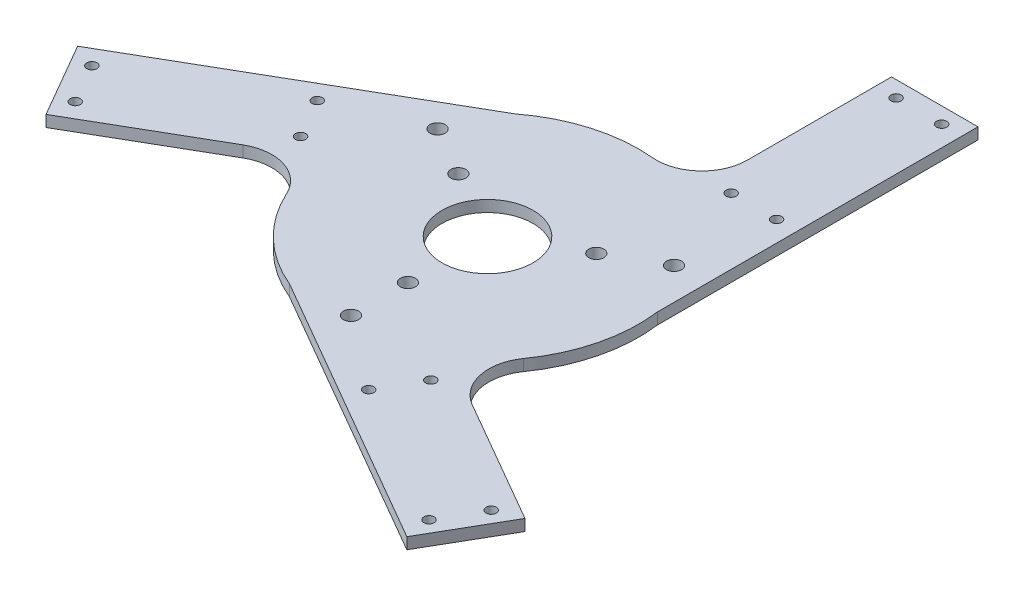
ISO-10303-21;
HEADER;
FILE_DESCRIPTION(('STEP AP214'),'2;1');
FILE_NAME('part.step','',(''),(''),'','','');
FILE_SCHEMA(('AUTOMOTIVE_DESIGN { 1 0 10303 214 1 1 1 1 }'));
ENDSEC;
DATA;
#1=APPLICATION_CONTEXT('core data for automotive mechanical design processes');
#2=APPLICATION_PROTOCOL_DEFINITION('international standard','automotive_design',2000,#1);
#3=PRODUCT_CONTEXT('',#1,'mechanical');
#4=PRODUCT('Part','Part','',(#3));
#5=PRODUCT_RELATED_PRODUCT_CATEGORY('part','',(#4));
#6=PRODUCT_DEFINITION_FORMATION('','',#4);
#7=PRODUCT_DEFINITION_CONTEXT('part definition',#1,'design');
#8=PRODUCT_DEFINITION('design','',#6,#7);
#9=PRODUCT_DEFINITION_SHAPE('','',#8);
#10=(LENGTH_UNIT() NAMED_UNIT(*) SI_UNIT(.MILLI.,.METRE.));
#11=(NAMED_UNIT(*) PLANE_ANGLE_UNIT() SI_UNIT($,.RADIAN.));
#12=(NAMED_UNIT(*) SI_UNIT($,.STERADIAN.) SOLID_ANGLE_UNIT());
#13=UNCERTAINTY_MEASURE_WITH_UNIT(LENGTH_MEASURE(1.E-05),#10,'distance_accuracy_value','');
#14=(GEOMETRIC_REPRESENTATION_CONTEXT(3) GLOBAL_UNCERTAINTY_ASSIGNED_CONTEXT((#13)) GLOBAL_UNIT_ASSIGNED_CONTEXT((#10,
#11,#12)) REPRESENTATION_CONTEXT('',''));
#15=CARTESIAN_POINT('',(0.,0.,0.));
#16=DIRECTION('',(0.,0.,1.));
#17=DIRECTION('',(1.,0.,0.));
#18=AXIS2_PLACEMENT_3D('',#15,#16,#17);
#19=CARTESIAN_POINT('',(28.01,-5.,0.));
#20=DIRECTION('',(1.,0.,0.));
#21=DIRECTION('',(0.,0.,-1.));
#22=AXIS2_PLACEMENT_3D('',#19,#20,#21);
#23=PLANE('',#22);
#24=DIRECTION('',(0.,0.,-1.));
#25=VECTOR('',#24,1.);
#26=CARTESIAN_POINT('',(28.01,0.,0.));
#27=LINE('',#26,#25);
#28=CARTESIAN_POINT('',(28.01,0.,-86.2045653840739));
#29=VERTEX_POINT('',#28);
#30=CARTESIAN_POINT('',(28.01,0.,-149.538220784093));
#31=VERTEX_POINT('',#30);
#32=EDGE_CURVE('E195',#29,#31,#27,.T.);
#33=ORIENTED_EDGE('',*,*,#32,.T.);
#34=DIRECTION('',(0.,1.,0.));
#35=VECTOR('',#34,1.);
#36=CARTESIAN_POINT('',(28.01,-5.,-149.538220784093));
#37=LINE('',#36,#35);
#38=CARTESIAN_POINT('',(28.01,-5.,-149.538220784093));
#39=VERTEX_POINT('',#38);
#40=EDGE_CURVE('E11',#39,#31,#37,.T.);
#41=ORIENTED_EDGE('',*,*,#40,.F.);
#42=DIRECTION('',(0.,0.,-1.));
#43=VECTOR('',#42,1.);
#44=CARTESIAN_POINT('',(28.01,-5.,0.));
#45=LINE('',#44,#43);
#46=CARTESIAN_POINT('',(28.01,-5.,-86.2045653840739));
#47=VERTEX_POINT('',#46);
#48=EDGE_CURVE('E185',#47,#39,#45,.T.);
#49=ORIENTED_EDGE('',*,*,#48,.F.);
#50=DIRECTION('',(0.,1.,0.));
#51=VECTOR('',#50,1.);
#52=CARTESIAN_POINT('',(28.01,-5.,-86.2045653840739));
#53=LINE('',#52,#51);
#54=EDGE_CURVE('E42',#47,#29,#53,.T.);
#55=ORIENTED_EDGE('',*,*,#54,.T.);
#56=EDGE_LOOP('',(#33,#41,#49,#55));
#57=FACE_BOUND('',#56,.T.);
#58=ADVANCED_FACE('F39',(#57),#23,.F.);
#59=CARTESIAN_POINT('',(-1.09224194589461E-13,-5.,-149.538220784093));
#60=DIRECTION('',(0.,0.,1.));
#61=DIRECTION('',(1.,0.,0.));
#62=AXIS2_PLACEMENT_3D('',#59,#60,#61);
#63=PLANE('',#62);
#64=DIRECTION('',(1.,0.,0.));
#65=VECTOR('',#64,1.);
#66=CARTESIAN_POINT('',(-1.09224194589461E-13,0.,-149.538220784093));
#67=LINE('',#66,#65);
#68=CARTESIAN_POINT('',(66.01,0.,-149.538220784093));
#69=VERTEX_POINT('',#68);
#70=EDGE_CURVE('E103',#31,#69,#67,.T.);
#71=ORIENTED_EDGE('',*,*,#70,.T.);
#72=DIRECTION('',(0.,1.,0.));
#73=VECTOR('',#72,1.);
#74=CARTESIAN_POINT('',(66.01,-5.,-149.538220784093));
#75=LINE('',#74,#73);
#76=CARTESIAN_POINT('',(66.01,-5.,-149.538220784093));
#77=VERTEX_POINT('',#76);
#78=EDGE_CURVE('E48',#77,#69,#75,.T.);
#79=ORIENTED_EDGE('',*,*,#78,.F.);
#80=DIRECTION('',(1.,0.,0.));
#81=VECTOR('',#80,1.);
#82=CARTESIAN_POINT('',(-1.09224194589461E-13,-5.,-149.538220784093));
#83=LINE('',#82,#81);
#84=EDGE_CURVE('E56',#39,#77,#83,.T.);
#85=ORIENTED_EDGE('',*,*,#84,.F.);
#86=ORIENTED_EDGE('',*,*,#40,.T.);
#87=EDGE_LOOP('',(#71,#79,#85,#86));
#88=FACE_BOUND('',#87,.T.);
#89=ADVANCED_FACE('F474',(#88),#63,.F.);
#90=CARTESIAN_POINT('',(66.01,-5.,0.));
#91=DIRECTION('',(-1.,0.,0.));
#92=DIRECTION('',(0.,0.,1.));
#93=AXIS2_PLACEMENT_3D('',#90,#91,#92);
#94=PLANE('',#93);
#95=DIRECTION('',(0.,0.,1.));
#96=VECTOR('',#95,1.);
#97=CARTESIAN_POINT('',(66.01,0.,0.));
#98=LINE('',#97,#96);
#99=CARTESIAN_POINT('',(66.01,0.,-8.66203924603394));
#100=VERTEX_POINT('',#99);
#101=EDGE_CURVE('E162',#69,#100,#98,.T.);
#102=ORIENTED_EDGE('',*,*,#101,.T.);
#103=DIRECTION('',(0.,1.,0.));
#104=VECTOR('',#103,1.);
#105=CARTESIAN_POINT('',(66.01,-5.,-8.66203924603394));
#106=LINE('',#105,#104);
#107=CARTESIAN_POINT('',(66.01,-5.,-8.66203924603394));
#108=VERTEX_POINT('',#107);
#109=EDGE_CURVE('E160',#108,#100,#106,.T.);
#110=ORIENTED_EDGE('',*,*,#109,.F.);
#111=DIRECTION('',(0.,0.,1.));
#112=VECTOR('',#111,1.);
#113=CARTESIAN_POINT('',(66.01,-5.,0.));
#114=LINE('',#113,#112);
#115=EDGE_CURVE('E152',#77,#108,#114,.T.);
#116=ORIENTED_EDGE('',*,*,#115,.F.);
#117=ORIENTED_EDGE('',*,*,#78,.T.);
#118=EDGE_LOOP('',(#102,#110,#116,#117));
#119=FACE_BOUND('',#118,.T.);
#120=ADVANCED_FACE('F161',(#119),#94,.F.);
#121=CARTESIAN_POINT('',(0.,-5.,0.));
#122=DIRECTION('',(0.,1.,0.));
#123=DIRECTION('',(0.,0.,1.));
#124=AXIS2_PLACEMENT_3D('',#121,#122,#123);
#125=CYLINDRICAL_SURFACE('',#124,66.5759042289313);
#126=CARTESIAN_POINT('',(0.,0.,0.));
#127=DIRECTION('',(0.,1.,0.));
#128=DIRECTION('',(0.,0.,1.));
#129=AXIS2_PLACEMENT_3D('',#126,#127,#128);
#130=CIRCLE('',#129,66.5759042289313);
#131=CARTESIAN_POINT('',(54.329325780327,0.,38.4795450097182));
#132=VERTEX_POINT('',#131);
#133=EDGE_CURVE('E362',#132,#100,#130,.T.);
#134=ORIENTED_EDGE('',*,*,#133,.F.);
#135=DIRECTION('',(0.,1.,0.));
#136=VECTOR('',#135,1.);
#137=CARTESIAN_POINT('',(54.329325780327,-5.,38.4795450097182));
#138=LINE('',#137,#136);
#139=CARTESIAN_POINT('',(54.329325780327,-5.,38.4795450097182));
#140=VERTEX_POINT('',#139);
#141=EDGE_CURVE('E166',#140,#132,#138,.T.);
#142=ORIENTED_EDGE('',*,*,#141,.F.);
#143=CARTESIAN_POINT('',(0.,-5.,0.));
#144=DIRECTION('',(0.,1.,0.));
#145=DIRECTION('',(0.,0.,1.));
#146=AXIS2_PLACEMENT_3D('',#143,#144,#145);
#147=CIRCLE('',#146,66.5759042289313);
#148=EDGE_CURVE('E156',#140,#108,#147,.T.);
#149=ORIENTED_EDGE('',*,*,#148,.T.);
#150=ORIENTED_EDGE('',*,*,#109,.T.);
#151=EDGE_LOOP('',(#134,#142,#149,#150));
#152=FACE_BOUND('',#151,.T.);
#153=ADVANCED_FACE('F168',(#152),#125,.T.);
#154=CARTESIAN_POINT('',(70.6503435448045,-5.,50.0391461763507));
#155=DIRECTION('',(0.,1.,0.));
#156=DIRECTION('',(0.,0.,1.));
#157=AXIS2_PLACEMENT_3D('',#154,#155,#156);
#158=CYLINDRICAL_SURFACE('',#157,20.);
#159=CARTESIAN_POINT('',(70.6503435448045,0.,50.0391461763507));
#160=DIRECTION('',(0.,1.,0.));
#161=DIRECTION('',(0.,0.,1.));
#162=AXIS2_PLACEMENT_3D('',#159,#160,#161);
#163=CIRCLE('',#162,20.);
#164=CARTESIAN_POINT('',(60.6503435448044,0.,67.3596542520394));
#165=VERTEX_POINT('',#164);
#166=EDGE_CURVE('E379',#132,#165,#163,.T.);
#167=ORIENTED_EDGE('',*,*,#166,.T.);
#168=DIRECTION('',(0.,1.,0.));
#169=VECTOR('',#168,1.);
#170=CARTESIAN_POINT('',(60.6503435448044,-5.,67.3596542520394));
#171=LINE('',#170,#169);
#172=CARTESIAN_POINT('',(60.6503435448044,-5.,67.3596542520394));
#173=VERTEX_POINT('',#172);
#174=EDGE_CURVE('E385',#173,#165,#171,.T.);
#175=ORIENTED_EDGE('',*,*,#174,.F.);
#176=CARTESIAN_POINT('',(70.6503435448045,-5.,50.0391461763507));
#177=DIRECTION('',(0.,1.,0.));
#178=DIRECTION('',(0.,0.,1.));
#179=AXIS2_PLACEMENT_3D('',#176,#177,#178);
#180=CIRCLE('',#179,20.);
#181=EDGE_CURVE('E170',#140,#173,#180,.T.);
#182=ORIENTED_EDGE('',*,*,#181,.F.);
#183=ORIENTED_EDGE('',*,*,#141,.T.);
#184=EDGE_LOOP('',(#167,#175,#182,#183));
#185=FACE_BOUND('',#184,.T.);
#186=ADVANCED_FACE('F446',(#185),#158,.F.);
#187=CARTESIAN_POINT('',(-14.0050000000001,-5.,24.2573715600021));
#188=DIRECTION('',(-0.500000000000004,0.,0.866025403784436));
#189=DIRECTION('',(0.866025403784436,0.,0.500000000000004));
#190=AXIS2_PLACEMENT_3D('',#187,#188,#189);
#191=PLANE('',#190);
#192=DIRECTION('',(0.866025403784436,0.,0.500000000000004));
#193=VECTOR('',#192,1.);
#194=CARTESIAN_POINT('',(-14.0050000000001,0.,24.2573715600021));
#195=LINE('',#194,#193);
#196=CARTESIAN_POINT('',(115.49889803575,0.,99.0264819520493));
#197=VERTEX_POINT('',#196);
#198=EDGE_CURVE('E377',#165,#197,#195,.T.);
#199=ORIENTED_EDGE('',*,*,#198,.T.);
#200=DIRECTION('',(0.,1.,0.));
#201=VECTOR('',#200,1.);
#202=CARTESIAN_POINT('',(115.49889803575,-5.,99.0264819520493));
#203=LINE('',#202,#201);
#204=CARTESIAN_POINT('',(115.49889803575,-5.,99.0264819520493));
#205=VERTEX_POINT('',#204);
#206=EDGE_CURVE('E388',#205,#197,#203,.T.);
#207=ORIENTED_EDGE('',*,*,#206,.F.);
#208=DIRECTION('',(0.866025403784436,0.,0.500000000000004));
#209=VECTOR('',#208,1.);
#210=CARTESIAN_POINT('',(-14.0050000000001,-5.,24.2573715600021));
#211=LINE('',#210,#209);
#212=EDGE_CURVE('E174',#173,#205,#211,.T.);
#213=ORIENTED_EDGE('',*,*,#212,.F.);
#214=ORIENTED_EDGE('',*,*,#174,.T.);
#215=EDGE_LOOP('',(#199,#207,#213,#214));
#216=FACE_BOUND('',#215,.T.);
#217=ADVANCED_FACE('F449',(#216),#191,.F.);
#218=CARTESIAN_POINT('',(129.503898035751,-5.,74.769110392047));
#219=DIRECTION('',(-0.866025403784437,0.,-0.500000000000003));
#220=DIRECTION('',(-0.500000000000003,0.,0.866025403784437));
#221=AXIS2_PLACEMENT_3D('',#218,#219,#220);
#222=PLANE('',#221);
#223=DIRECTION('',(-0.500000000000003,0.,0.866025403784437));
#224=VECTOR('',#223,1.);
#225=CARTESIAN_POINT('',(129.503898035751,0.,74.769110392047));
#226=LINE('',#225,#224);
#227=CARTESIAN_POINT('',(96.4988980357503,0.,131.935447295858));
#228=VERTEX_POINT('',#227);
#229=EDGE_CURVE('E375',#197,#228,#226,.T.);
#230=ORIENTED_EDGE('',*,*,#229,.T.);
#231=DIRECTION('',(0.,1.,0.));
#232=VECTOR('',#231,1.);
#233=CARTESIAN_POINT('',(96.4988980357503,-5.,131.935447295858));
#234=LINE('',#233,#232);
#235=CARTESIAN_POINT('',(96.4988980357503,-5.,131.935447295858));
#236=VERTEX_POINT('',#235);
#237=EDGE_CURVE('E391',#236,#228,#234,.T.);
#238=ORIENTED_EDGE('',*,*,#237,.F.);
#239=DIRECTION('',(-0.500000000000003,0.,0.866025403784437));
#240=VECTOR('',#239,1.);
#241=CARTESIAN_POINT('',(129.503898035751,-5.,74.769110392047));
#242=LINE('',#241,#240);
#243=EDGE_CURVE('E452',#205,#236,#242,.T.);
#244=ORIENTED_EDGE('',*,*,#243,.F.);
#245=ORIENTED_EDGE('',*,*,#206,.T.);
#246=EDGE_LOOP('',(#230,#238,#244,#245));
#247=FACE_BOUND('',#246,.T.);
#248=ADVANCED_FACE('F464',(#247),#222,.F.);
#249=CARTESIAN_POINT('',(-33.0050000000003,-5.,57.1663369038107));
#250=DIRECTION('',(0.500000000000004,0.,-0.866025403784436));
#251=DIRECTION('',(-0.866025403784436,0.,-0.500000000000004));
#252=AXIS2_PLACEMENT_3D('',#249,#250,#251);
#253=PLANE('',#252);
#254=DIRECTION('',(-0.866025403784436,0.,-0.500000000000004));
#255=VECTOR('',#254,1.);
#256=CARTESIAN_POINT('',(-33.0050000000003,0.,57.1663369038107));
#257=LINE('',#256,#255);
#258=CARTESIAN_POINT('',(-25.5034539643571,0.,61.4973565268277));
#259=VERTEX_POINT('',#258);
#260=EDGE_CURVE('E372',#228,#259,#257,.T.);
#261=ORIENTED_EDGE('',*,*,#260,.T.);
#262=DIRECTION('',(0.,1.,0.));
#263=VECTOR('',#262,1.);
#264=CARTESIAN_POINT('',(-25.5034539643571,-5.,61.4973565268277));
#265=LINE('',#264,#263);
#266=CARTESIAN_POINT('',(-25.5034539643571,-5.,61.4973565268277));
#267=VERTEX_POINT('',#266);
#268=EDGE_CURVE('E394',#267,#259,#265,.T.);
#269=ORIENTED_EDGE('',*,*,#268,.F.);
#270=DIRECTION('',(-0.866025403784436,0.,-0.500000000000004));
#271=VECTOR('',#270,1.);
#272=CARTESIAN_POINT('',(-33.0050000000003,-5.,57.1663369038107));
#273=LINE('',#272,#271);
#274=EDGE_CURVE('E179',#236,#267,#273,.T.);
#275=ORIENTED_EDGE('',*,*,#274,.F.);
#276=ORIENTED_EDGE('',*,*,#237,.T.);
#277=EDGE_LOOP('',(#261,#269,#275,#276));
#278=FACE_BOUND('',#277,.T.);
#279=ADVANCED_FACE('F462',(#278),#253,.F.);
#280=CARTESIAN_POINT('',(-60.4889263946463,0.,27.8108037913846));
#281=VERTEX_POINT('',#280);
#282=EDGE_CURVE('E363',#281,#259,#130,.T.);
#283=ORIENTED_EDGE('',*,*,#282,.F.);
#284=DIRECTION('',(0.,1.,0.));
#285=VECTOR('',#284,1.);
#286=CARTESIAN_POINT('',(-60.4889263946463,-5.,27.8108037913846));
#287=LINE('',#286,#285);
#288=CARTESIAN_POINT('',(-60.4889263946463,-5.,27.8108037913846));
#289=VERTEX_POINT('',#288);
#290=EDGE_CURVE('E396',#289,#281,#287,.T.);
#291=ORIENTED_EDGE('',*,*,#290,.F.);
#292=EDGE_CURVE('E172',#289,#267,#147,.T.);
#293=ORIENTED_EDGE('',*,*,#292,.T.);
#294=ORIENTED_EDGE('',*,*,#268,.T.);
#295=EDGE_LOOP('',(#283,#291,#293,#294));
#296=FACE_BOUND('',#295,.T.);
#297=ADVANCED_FACE('F439',(#296),#125,.T.);
#298=CARTESIAN_POINT('',(-78.660343544805,-5.,36.1654192077229));
#299=DIRECTION('',(0.,1.,0.));
#300=DIRECTION('',(0.,0.,1.));
#301=AXIS2_PLACEMENT_3D('',#298,#299,#300);
#302=CYLINDRICAL_SURFACE('',#301,20.);
#303=CARTESIAN_POINT('',(-78.660343544805,0.,36.1654192077229));
#304=DIRECTION('',(0.,1.,0.));
#305=DIRECTION('',(0.,0.,1.));
#306=AXIS2_PLACEMENT_3D('',#303,#304,#305);
#307=CIRCLE('',#306,20.);
#308=CARTESIAN_POINT('',(-88.6603435448049,0.,18.844911132034));
#309=VERTEX_POINT('',#308);
#310=EDGE_CURVE('E370',#281,#309,#307,.T.);
#311=ORIENTED_EDGE('',*,*,#310,.T.);
#312=DIRECTION('',(0.,1.,0.));
#313=VECTOR('',#312,1.);
#314=CARTESIAN_POINT('',(-88.6603435448049,-5.,18.844911132034));
#315=LINE('',#314,#313);
#316=CARTESIAN_POINT('',(-88.6603435448049,-5.,18.844911132034));
#317=VERTEX_POINT('',#316);
#318=EDGE_CURVE('E398',#317,#309,#315,.T.);
#319=ORIENTED_EDGE('',*,*,#318,.F.);
#320=CARTESIAN_POINT('',(-78.660343544805,-5.,36.1654192077229));
#321=DIRECTION('',(0.,1.,0.));
#322=DIRECTION('',(0.,0.,1.));
#323=AXIS2_PLACEMENT_3D('',#320,#321,#322);
#324=CIRCLE('',#323,20.);
#325=EDGE_CURVE('E180',#289,#317,#324,.T.);
#326=ORIENTED_EDGE('',*,*,#325,.F.);
#327=ORIENTED_EDGE('',*,*,#290,.T.);
#328=EDGE_LOOP('',(#311,#319,#326,#327));
#329=FACE_BOUND('',#328,.T.);
#330=ADVANCED_FACE('F433',(#329),#302,.F.);
#331=CARTESIAN_POINT('',(-14.0049999999998,-5.,-24.2573715600022));
#332=DIRECTION('',(-0.499999999999992,0.,-0.866025403784443));
#333=DIRECTION('',(-0.866025403784443,0.,0.499999999999992));
#334=AXIS2_PLACEMENT_3D('',#331,#332,#333);
#335=PLANE('',#334);
#336=DIRECTION('',(-0.866025403784443,0.,0.499999999999992));
#337=VECTOR('',#336,1.);
#338=CARTESIAN_POINT('',(-14.0049999999998,0.,-24.2573715600022));
#339=LINE('',#338,#337);
#340=CARTESIAN_POINT('',(-143.508898035751,0.,50.5117388320431));
#341=VERTEX_POINT('',#340);
#342=EDGE_CURVE('E368',#309,#341,#339,.T.);
#343=ORIENTED_EDGE('',*,*,#342,.T.);
#344=DIRECTION('',(0.,1.,0.));
#345=VECTOR('',#344,1.);
#346=CARTESIAN_POINT('',(-143.508898035751,-5.,50.5117388320431));
#347=LINE('',#346,#345);
#348=CARTESIAN_POINT('',(-143.508898035751,-5.,50.5117388320431));
#349=VERTEX_POINT('',#348);
#350=EDGE_CURVE('E401',#349,#341,#347,.T.);
#351=ORIENTED_EDGE('',*,*,#350,.F.);
#352=DIRECTION('',(-0.866025403784443,0.,0.499999999999992));
#353=VECTOR('',#352,1.);
#354=CARTESIAN_POINT('',(-14.0049999999998,-5.,-24.2573715600022));
#355=LINE('',#354,#353);
#356=EDGE_CURVE('E429',#317,#349,#355,.T.);
#357=ORIENTED_EDGE('',*,*,#356,.F.);
#358=ORIENTED_EDGE('',*,*,#318,.T.);
#359=EDGE_LOOP('',(#343,#351,#357,#358));
#360=FACE_BOUND('',#359,.T.);
#361=ADVANCED_FACE('F428',(#360),#335,.F.);
#362=CARTESIAN_POINT('',(-129.503898035751,-5.,74.7691103920455));
#363=DIRECTION('',(0.866025403784443,0.,-0.499999999999993));
#364=DIRECTION('',(-0.499999999999993,0.,-0.866025403784443));
#365=AXIS2_PLACEMENT_3D('',#362,#363,#364);
#366=PLANE('',#365);
#367=DIRECTION('',(-0.499999999999993,0.,-0.866025403784443));
#368=VECTOR('',#367,1.);
#369=CARTESIAN_POINT('',(-129.503898035751,0.,74.7691103920455));
#370=LINE('',#369,#368);
#371=CARTESIAN_POINT('',(-162.508898035751,0.,17.6027734882343));
#372=VERTEX_POINT('',#371);
#373=EDGE_CURVE('E366',#341,#372,#370,.T.);
#374=ORIENTED_EDGE('',*,*,#373,.T.);
#375=DIRECTION('',(0.,1.,0.));
#376=VECTOR('',#375,1.);
#377=CARTESIAN_POINT('',(-162.508898035751,-5.,17.6027734882343));
#378=LINE('',#377,#376);
#379=CARTESIAN_POINT('',(-162.508898035751,-5.,17.6027734882343));
#380=VERTEX_POINT('',#379);
#381=EDGE_CURVE('E404',#380,#372,#378,.T.);
#382=ORIENTED_EDGE('',*,*,#381,.F.);
#383=DIRECTION('',(-0.499999999999993,0.,-0.866025403784443));
#384=VECTOR('',#383,1.);
#385=CARTESIAN_POINT('',(-129.503898035751,-5.,74.7691103920455));
#386=LINE('',#385,#384);
#387=EDGE_CURVE('E184',#349,#380,#386,.T.);
#388=ORIENTED_EDGE('',*,*,#387,.F.);
#389=ORIENTED_EDGE('',*,*,#350,.T.);
#390=EDGE_LOOP('',(#374,#382,#388,#389));
#391=FACE_BOUND('',#390,.T.);
#392=ADVANCED_FACE('F424',(#391),#366,.F.);
#393=CARTESIAN_POINT('',(-33.0049999999994,-5.,-57.1663369038111));
#394=DIRECTION('',(0.499999999999992,0.,0.866025403784443));
#395=DIRECTION('',(0.866025403784443,0.,-0.499999999999992));
#396=AXIS2_PLACEMENT_3D('',#393,#394,#395);
#397=PLANE('',#396);
#398=DIRECTION('',(0.866025403784443,0.,-0.499999999999992));
#399=VECTOR('',#398,1.);
#400=CARTESIAN_POINT('',(-33.0049999999994,0.,-57.1663369038111));
#401=LINE('',#400,#399);
#402=CARTESIAN_POINT('',(-40.5065460356427,0.,-52.8353172807942));
#403=VERTEX_POINT('',#402);
#404=EDGE_CURVE('E361',#372,#403,#401,.T.);
#405=ORIENTED_EDGE('',*,*,#404,.T.);
#406=DIRECTION('',(0.,1.,0.));
#407=VECTOR('',#406,1.);
#408=CARTESIAN_POINT('',(-40.5065460356427,-5.,-52.8353172807942));
#409=LINE('',#408,#407);
#410=CARTESIAN_POINT('',(-40.5065460356427,-5.,-52.8353172807942));
#411=VERTEX_POINT('',#410);
#412=EDGE_CURVE('E407',#411,#403,#409,.T.);
#413=ORIENTED_EDGE('',*,*,#412,.F.);
#414=DIRECTION('',(0.866025403784443,0.,-0.499999999999992));
#415=VECTOR('',#414,1.);
#416=CARTESIAN_POINT('',(-33.0049999999994,-5.,-57.1663369038111));
#417=LINE('',#416,#415);
#418=EDGE_CURVE('E182',#380,#411,#417,.T.);
#419=ORIENTED_EDGE('',*,*,#418,.F.);
#420=ORIENTED_EDGE('',*,*,#381,.T.);
#421=EDGE_LOOP('',(#405,#413,#419,#420));
#422=FACE_BOUND('',#421,.T.);
#423=ADVANCED_FACE('F417',(#422),#397,.F.);
#424=CARTESIAN_POINT('',(6.1596006143189,0.,-66.2903488011031));
#425=VERTEX_POINT('',#424);
#426=EDGE_CURVE('E356',#425,#403,#130,.T.);
#427=ORIENTED_EDGE('',*,*,#426,.F.);
#428=DIRECTION('',(0.,1.,0.));
#429=VECTOR('',#428,1.);
#430=CARTESIAN_POINT('',(6.1596006143189,-5.,-66.2903488011031));
#431=LINE('',#430,#429);
#432=CARTESIAN_POINT('',(6.1596006143189,-5.,-66.2903488011031));
#433=VERTEX_POINT('',#432);
#434=EDGE_CURVE('E408',#433,#425,#431,.T.);
#435=ORIENTED_EDGE('',*,*,#434,.F.);
#436=EDGE_CURVE('E173',#433,#411,#147,.T.);
#437=ORIENTED_EDGE('',*,*,#436,.T.);
#438=ORIENTED_EDGE('',*,*,#412,.T.);
#439=EDGE_LOOP('',(#427,#435,#437,#438));
#440=FACE_BOUND('',#439,.T.);
#441=ADVANCED_FACE('F419',(#440),#125,.T.);
#442=CARTESIAN_POINT('',(8.01,-5.,-86.2045653840739));
#443=DIRECTION('',(0.,1.,0.));
#444=DIRECTION('',(0.,0.,1.));
#445=AXIS2_PLACEMENT_3D('',#442,#443,#444);
#446=CYLINDRICAL_SURFACE('',#445,20.);
#447=CARTESIAN_POINT('',(8.01,0.,-86.2045653840739));
#448=DIRECTION('',(0.,1.,0.));
#449=DIRECTION('',(0.,0.,1.));
#450=AXIS2_PLACEMENT_3D('',#447,#448,#449);
#451=CIRCLE('',#450,20.);
#452=EDGE_CURVE('E350',#425,#29,#451,.T.);
#453=ORIENTED_EDGE('',*,*,#452,.T.);
#454=ORIENTED_EDGE('',*,*,#54,.F.);
#455=CARTESIAN_POINT('',(8.01,-5.,-86.2045653840739));
#456=DIRECTION('',(0.,1.,0.));
#457=DIRECTION('',(0.,0.,1.));
#458=AXIS2_PLACEMENT_3D('',#455,#456,#457);
#459=CIRCLE('',#458,20.);
#460=EDGE_CURVE('E115',#433,#47,#459,.T.);
#461=ORIENTED_EDGE('',*,*,#460,.F.);
#462=ORIENTED_EDGE('',*,*,#434,.T.);
#463=EDGE_LOOP('',(#453,#454,#461,#462));
#464=FACE_BOUND('',#463,.T.);
#465=ADVANCED_FACE('F411',(#464),#446,.F.);
#466=CARTESIAN_POINT('',(0.,-5.,0.));
#467=DIRECTION('',(0.,1.,0.));
#468=DIRECTION('',(0.,0.,1.));
#469=AXIS2_PLACEMENT_3D('',#466,#467,#468);
#470=PLANE('',#469);
#471=CARTESIAN_POINT('',(57.01,-5.,-142.538220784093));
#472=DIRECTION('',(0.,1.,0.));
#473=DIRECTION('',(0.,0.,1.));
#474=AXIS2_PLACEMENT_3D('',#471,#472,#473);
#475=CIRCLE('',#474,2.24999999999999);
#476=CARTESIAN_POINT('',(57.01,-5.,-140.288220784093));
#477=VERTEX_POINT('',#476);
#478=EDGE_CURVE('E297',#477,#477,#475,.T.);
#479=ORIENTED_EDGE('',*,*,#478,.T.);
#480=EDGE_LOOP('',(#479));
#481=FACE_BOUND('',#480,.T.);
#482=CARTESIAN_POINT('',(37.0100000000001,-5.,-142.538220784093));
#483=DIRECTION('',(0.,1.,0.));
#484=DIRECTION('',(0.,0.,1.));
#485=AXIS2_PLACEMENT_3D('',#482,#483,#484);
#486=CIRCLE('',#485,2.24999999999999);
#487=CARTESIAN_POINT('',(37.0100000000001,-5.,-140.288220784093));
#488=VERTEX_POINT('',#487);
#489=EDGE_CURVE('E291',#488,#488,#486,.T.);
#490=ORIENTED_EDGE('',*,*,#489,.T.);
#491=EDGE_LOOP('',(#490));
#492=FACE_BOUND('',#491,.T.);
#493=CARTESIAN_POINT('',(37.0100000000001,-5.,-70.0382207840932));
#494=DIRECTION('',(0.,1.,0.));
#495=DIRECTION('',(0.,0.,1.));
#496=AXIS2_PLACEMENT_3D('',#493,#494,#495);
#497=CIRCLE('',#496,2.24999999999999);
#498=CARTESIAN_POINT('',(37.0100000000001,-5.,-67.7882207840932));
#499=VERTEX_POINT('',#498);
#500=EDGE_CURVE('E285',#499,#499,#497,.T.);
#501=ORIENTED_EDGE('',*,*,#500,.T.);
#502=EDGE_LOOP('',(#501));
#503=FACE_BOUND('',#502,.T.);
#504=CARTESIAN_POINT('',(57.0100000000001,-5.,-70.0382207840932));
#505=DIRECTION('',(0.,1.,0.));
#506=DIRECTION('',(0.,0.,1.));
#507=AXIS2_PLACEMENT_3D('',#504,#505,#506);
#508=CIRCLE('',#507,2.24999999999999);
#509=CARTESIAN_POINT('',(57.0100000000001,-5.,-67.7882207840932));
#510=VERTEX_POINT('',#509);
#511=EDGE_CURVE('E279',#510,#510,#508,.T.);
#512=ORIENTED_EDGE('',*,*,#511,.T.);
#513=EDGE_LOOP('',(#512));
#514=FACE_BOUND('',#513,.T.);
#515=CARTESIAN_POINT('',(94.9367202092832,-5.,120.641218661793));
#516=DIRECTION('',(0.,1.,0.));
#517=DIRECTION('',(0.,0.,1.));
#518=AXIS2_PLACEMENT_3D('',#515,#516,#517);
#519=CIRCLE('',#518,2.24999999999999);
#520=CARTESIAN_POINT('',(94.9367202092832,-5.,122.891218661793));
#521=VERTEX_POINT('',#520);
#522=EDGE_CURVE('E273',#521,#521,#519,.T.);
#523=ORIENTED_EDGE('',*,*,#522,.T.);
#524=EDGE_LOOP('',(#523));
#525=FACE_BOUND('',#524,.T.);
#526=CARTESIAN_POINT('',(104.936720209283,-5.,103.320710586105));
#527=DIRECTION('',(0.,1.,0.));
#528=DIRECTION('',(0.,0.,1.));
#529=AXIS2_PLACEMENT_3D('',#526,#527,#528);
#530=CIRCLE('',#529,2.24999999999999);
#531=CARTESIAN_POINT('',(104.936720209283,-5.,105.570710586105));
#532=VERTEX_POINT('',#531);
#533=EDGE_CURVE('E267',#532,#532,#530,.T.);
#534=ORIENTED_EDGE('',*,*,#533,.T.);
#535=EDGE_LOOP('',(#534));
#536=FACE_BOUND('',#535,.T.);
#537=CARTESIAN_POINT('',(42.1498784349114,-5.,67.0707105861046));
#538=DIRECTION('',(0.,1.,0.));
#539=DIRECTION('',(0.,0.,1.));
#540=AXIS2_PLACEMENT_3D('',#537,#538,#539);
#541=CIRCLE('',#540,2.24999999999999);
#542=CARTESIAN_POINT('',(42.1498784349114,-5.,69.3207105861046));
#543=VERTEX_POINT('',#542);
#544=EDGE_CURVE('E261',#543,#543,#541,.T.);
#545=ORIENTED_EDGE('',*,*,#544,.T.);
#546=EDGE_LOOP('',(#545));
#547=FACE_BOUND('',#546,.T.);
#548=CARTESIAN_POINT('',(32.1498784349114,-5.,84.3912186617934));
#549=DIRECTION('',(0.,1.,0.));
#550=DIRECTION('',(0.,0.,1.));
#551=AXIS2_PLACEMENT_3D('',#548,#549,#550);
#552=CIRCLE('',#551,2.24999999999999);
#553=CARTESIAN_POINT('',(32.1498784349114,-5.,86.6412186617934));
#554=VERTEX_POINT('',#553);
#555=EDGE_CURVE('E255',#554,#554,#552,.T.);
#556=ORIENTED_EDGE('',*,*,#555,.T.);
#557=EDGE_LOOP('',(#556));
#558=FACE_BOUND('',#557,.T.);
#559=CARTESIAN_POINT('',(-151.946720209245,-5.,21.8970021223139));
#560=DIRECTION('',(0.,1.,0.));
#561=DIRECTION('',(0.,0.,1.));
#562=AXIS2_PLACEMENT_3D('',#559,#560,#561);
#563=CIRCLE('',#562,2.24999999999999);
#564=CARTESIAN_POINT('',(-151.946720209245,-5.,24.1470021223139));
#565=VERTEX_POINT('',#564);
#566=EDGE_CURVE('E249',#565,#565,#563,.T.);
#567=ORIENTED_EDGE('',*,*,#566,.T.);
#568=EDGE_LOOP('',(#567));
#569=FACE_BOUND('',#568,.T.);
#570=CARTESIAN_POINT('',(-141.946720209245,-5.,39.2175101980027));
#571=DIRECTION('',(0.,1.,0.));
#572=DIRECTION('',(0.,0.,1.));
#573=AXIS2_PLACEMENT_3D('',#570,#571,#572);
#574=CIRCLE('',#573,2.25);
#575=CARTESIAN_POINT('',(-141.946720209245,-5.,41.4675101980027));
#576=VERTEX_POINT('',#575);
#577=EDGE_CURVE('E243',#576,#576,#574,.T.);
#578=ORIENTED_EDGE('',*,*,#577,.T.);
#579=EDGE_LOOP('',(#578));
#580=FACE_BOUND('',#579,.T.);
#581=CARTESIAN_POINT('',(-79.1598784348728,-5.,2.9675101980027));
#582=DIRECTION('',(0.,1.,0.));
#583=DIRECTION('',(0.,0.,1.));
#584=AXIS2_PLACEMENT_3D('',#581,#582,#583);
#585=CIRCLE('',#584,2.24999999999999);
#586=CARTESIAN_POINT('',(-79.1598784348728,-5.,5.21751019800269));
#587=VERTEX_POINT('',#586);
#588=EDGE_CURVE('E237',#587,#587,#585,.T.);
#589=ORIENTED_EDGE('',*,*,#588,.T.);
#590=EDGE_LOOP('',(#589));
#591=FACE_BOUND('',#590,.T.);
#592=CARTESIAN_POINT('',(-89.1598784348728,-5.,-14.3529978776861));
#593=DIRECTION('',(0.,1.,0.));
#594=DIRECTION('',(0.,0.,1.));
#595=AXIS2_PLACEMENT_3D('',#592,#593,#594);
#596=CIRCLE('',#595,2.24999999999999);
#597=CARTESIAN_POINT('',(-89.1598784348728,-5.,-12.1029978776861));
#598=VERTEX_POINT('',#597);
#599=EDGE_CURVE('E231',#598,#598,#596,.T.);
#600=ORIENTED_EDGE('',*,*,#599,.T.);
#601=EDGE_LOOP('',(#600));
#602=FACE_BOUND('',#601,.T.);
#603=CARTESIAN_POINT('',(0.,-5.,60.));
#604=DIRECTION('',(0.,-1.,0.));
#605=DIRECTION('',(0.,0.,-1.));
#606=AXIS2_PLACEMENT_3D('',#603,#604,#605);
#607=CIRCLE('',#606,3.29999999999999);
#608=CARTESIAN_POINT('',(0.,-5.,56.7));
#609=VERTEX_POINT('',#608);
#610=EDGE_CURVE('E228',#609,#609,#607,.T.);
#611=ORIENTED_EDGE('',*,*,#610,.F.);
#612=EDGE_LOOP('',(#611));
#613=FACE_BOUND('',#612,.T.);
#614=CARTESIAN_POINT('',(0.,-5.,35.));
#615=DIRECTION('',(0.,-1.,0.));
#616=DIRECTION('',(0.,0.,-1.));
#617=AXIS2_PLACEMENT_3D('',#614,#615,#616);
#618=CIRCLE('',#617,3.29999999999999);
#619=CARTESIAN_POINT('',(0.,-5.,31.7));
#620=VERTEX_POINT('',#619);
#621=EDGE_CURVE('E222',#620,#620,#618,.T.);
#622=ORIENTED_EDGE('',*,*,#621,.F.);
#623=EDGE_LOOP('',(#622));
#624=FACE_BOUND('',#623,.T.);
#625=CARTESIAN_POINT('',(51.9615242270662,-5.,-30.0000000000002));
#626=DIRECTION('',(0.,-1.,0.));
#627=DIRECTION('',(0.,0.,-1.));
#628=AXIS2_PLACEMENT_3D('',#625,#626,#627);
#629=CIRCLE('',#628,3.29999999999998);
#630=CARTESIAN_POINT('',(51.9615242270662,-5.,-33.3000000000002));
#631=VERTEX_POINT('',#630);
#632=EDGE_CURVE('E216',#631,#631,#629,.T.);
#633=ORIENTED_EDGE('',*,*,#632,.F.);
#634=EDGE_LOOP('',(#633));
#635=FACE_BOUND('',#634,.T.);
#636=CARTESIAN_POINT('',(30.3108891324553,-5.,-17.5000000000001));
#637=DIRECTION('',(0.,-1.,0.));
#638=DIRECTION('',(0.,0.,-1.));
#639=AXIS2_PLACEMENT_3D('',#636,#637,#638);
#640=CIRCLE('',#639,3.29999999999999);
#641=CARTESIAN_POINT('',(30.3108891324553,-5.,-20.8000000000001));
#642=VERTEX_POINT('',#641);
#643=EDGE_CURVE('E210',#642,#642,#640,.T.);
#644=ORIENTED_EDGE('',*,*,#643,.F.);
#645=EDGE_LOOP('',(#644));
#646=FACE_BOUND('',#645,.T.);
#647=CARTESIAN_POINT('',(-51.9615242270666,-5.,-29.9999999999995));
#648=DIRECTION('',(0.,-1.,0.));
#649=DIRECTION('',(0.,0.,-1.));
#650=AXIS2_PLACEMENT_3D('',#647,#648,#649);
#651=CIRCLE('',#650,3.29999999999999);
#652=CARTESIAN_POINT('',(-51.9615242270666,-5.,-33.2999999999995));
#653=VERTEX_POINT('',#652);
#654=EDGE_CURVE('E204',#653,#653,#651,.T.);
#655=ORIENTED_EDGE('',*,*,#654,.F.);
#656=EDGE_LOOP('',(#655));
#657=FACE_BOUND('',#656,.T.);
#658=CARTESIAN_POINT('',(-30.3108891324555,-5.,-17.4999999999997));
#659=DIRECTION('',(0.,-1.,0.));
#660=DIRECTION('',(0.,0.,-1.));
#661=AXIS2_PLACEMENT_3D('',#658,#659,#660);
#662=CIRCLE('',#661,3.29999999999999);
#663=CARTESIAN_POINT('',(-30.3108891324555,-5.,-20.7999999999997));
#664=VERTEX_POINT('',#663);
#665=EDGE_CURVE('E198',#664,#664,#662,.T.);
#666=ORIENTED_EDGE('',*,*,#665,.F.);
#667=EDGE_LOOP('',(#666));
#668=FACE_BOUND('',#667,.T.);
#669=CARTESIAN_POINT('',(0.,-5.,0.));
#670=DIRECTION('',(0.,-1.,0.));
#671=DIRECTION('',(0.,0.,-1.));
#672=AXIS2_PLACEMENT_3D('',#669,#670,#671);
#673=CIRCLE('',#672,20.);
#674=CARTESIAN_POINT('',(0.,-5.,-20.));
#675=VERTEX_POINT('',#674);
#676=EDGE_CURVE('E188',#675,#675,#673,.T.);
#677=ORIENTED_EDGE('',*,*,#676,.F.);
#678=EDGE_LOOP('',(#677));
#679=FACE_BOUND('',#678,.T.);
#680=ORIENTED_EDGE('',*,*,#48,.T.);
#681=ORIENTED_EDGE('',*,*,#84,.T.);
#682=ORIENTED_EDGE('',*,*,#115,.T.);
#683=ORIENTED_EDGE('',*,*,#148,.F.);
#684=ORIENTED_EDGE('',*,*,#181,.T.);
#685=ORIENTED_EDGE('',*,*,#212,.T.);
#686=ORIENTED_EDGE('',*,*,#243,.T.);
#687=ORIENTED_EDGE('',*,*,#274,.T.);
#688=ORIENTED_EDGE('',*,*,#292,.F.);
#689=ORIENTED_EDGE('',*,*,#325,.T.);
#690=ORIENTED_EDGE('',*,*,#356,.T.);
#691=ORIENTED_EDGE('',*,*,#387,.T.);
#692=ORIENTED_EDGE('',*,*,#418,.T.);
#693=ORIENTED_EDGE('',*,*,#436,.F.);
#694=ORIENTED_EDGE('',*,*,#460,.T.);
#695=EDGE_LOOP('',(#680,#681,#682,#683,#684,#685,#686,#687,#688,#689,#690,#691,#692,#693,#694));
#696=FACE_BOUND('',#695,.T.);
#697=ADVANCED_FACE('F154',(#481,#492,#503,#514,#525,#536,#547,#558,#569,#580,#591,#602,#613,
#624,#635,#646,#657,#668,#679,#696),#470,.F.);
#698=CARTESIAN_POINT('',(0.,0.,0.));
#699=DIRECTION('',(0.,1.,0.));
#700=DIRECTION('',(0.,0.,1.));
#701=AXIS2_PLACEMENT_3D('',#698,#699,#700);
#702=PLANE('',#701);
#703=CARTESIAN_POINT('',(57.01,0.,-142.538220784093));
#704=DIRECTION('',(0.,1.,0.));
#705=DIRECTION('',(0.,0.,1.));
#706=AXIS2_PLACEMENT_3D('',#703,#704,#705);
#707=CIRCLE('',#706,2.24999999999999);
#708=CARTESIAN_POINT('',(57.01,0.,-140.288220784093));
#709=VERTEX_POINT('',#708);
#710=EDGE_CURVE('E300',#709,#709,#707,.T.);
#711=ORIENTED_EDGE('',*,*,#710,.F.);
#712=EDGE_LOOP('',(#711));
#713=FACE_BOUND('',#712,.T.);
#714=CARTESIAN_POINT('',(37.0100000000001,0.,-142.538220784093));
#715=DIRECTION('',(0.,1.,0.));
#716=DIRECTION('',(0.,0.,1.));
#717=AXIS2_PLACEMENT_3D('',#714,#715,#716);
#718=CIRCLE('',#717,2.24999999999999);
#719=CARTESIAN_POINT('',(37.0100000000001,0.,-140.288220784093));
#720=VERTEX_POINT('',#719);
#721=EDGE_CURVE('E294',#720,#720,#718,.T.);
#722=ORIENTED_EDGE('',*,*,#721,.F.);
#723=EDGE_LOOP('',(#722));
#724=FACE_BOUND('',#723,.T.);
#725=CARTESIAN_POINT('',(37.0100000000001,0.,-70.0382207840932));
#726=DIRECTION('',(0.,1.,0.));
#727=DIRECTION('',(0.,0.,1.));
#728=AXIS2_PLACEMENT_3D('',#725,#726,#727);
#729=CIRCLE('',#728,2.24999999999999);
#730=CARTESIAN_POINT('',(37.0100000000001,0.,-67.7882207840932));
#731=VERTEX_POINT('',#730);
#732=EDGE_CURVE('E288',#731,#731,#729,.T.);
#733=ORIENTED_EDGE('',*,*,#732,.F.);
#734=EDGE_LOOP('',(#733));
#735=FACE_BOUND('',#734,.T.);
#736=CARTESIAN_POINT('',(57.0100000000001,0.,-70.0382207840932));
#737=DIRECTION('',(0.,1.,0.));
#738=DIRECTION('',(0.,0.,1.));
#739=AXIS2_PLACEMENT_3D('',#736,#737,#738);
#740=CIRCLE('',#739,2.24999999999999);
#741=CARTESIAN_POINT('',(57.0100000000001,0.,-67.7882207840932));
#742=VERTEX_POINT('',#741);
#743=EDGE_CURVE('E282',#742,#742,#740,.T.);
#744=ORIENTED_EDGE('',*,*,#743,.F.);
#745=EDGE_LOOP('',(#744));
#746=FACE_BOUND('',#745,.T.);
#747=CARTESIAN_POINT('',(94.9367202092832,0.,120.641218661793));
#748=DIRECTION('',(0.,1.,0.));
#749=DIRECTION('',(0.,0.,1.));
#750=AXIS2_PLACEMENT_3D('',#747,#748,#749);
#751=CIRCLE('',#750,2.24999999999999);
#752=CARTESIAN_POINT('',(94.9367202092832,0.,122.891218661793));
#753=VERTEX_POINT('',#752);
#754=EDGE_CURVE('E276',#753,#753,#751,.T.);
#755=ORIENTED_EDGE('',*,*,#754,.F.);
#756=EDGE_LOOP('',(#755));
#757=FACE_BOUND('',#756,.T.);
#758=CARTESIAN_POINT('',(104.936720209283,0.,103.320710586105));
#759=DIRECTION('',(0.,1.,0.));
#760=DIRECTION('',(0.,0.,1.));
#761=AXIS2_PLACEMENT_3D('',#758,#759,#760);
#762=CIRCLE('',#761,2.24999999999999);
#763=CARTESIAN_POINT('',(104.936720209283,0.,105.570710586105));
#764=VERTEX_POINT('',#763);
#765=EDGE_CURVE('E270',#764,#764,#762,.T.);
#766=ORIENTED_EDGE('',*,*,#765,.F.);
#767=EDGE_LOOP('',(#766));
#768=FACE_BOUND('',#767,.T.);
#769=CARTESIAN_POINT('',(42.1498784349114,0.,67.0707105861046));
#770=DIRECTION('',(0.,1.,0.));
#771=DIRECTION('',(0.,0.,1.));
#772=AXIS2_PLACEMENT_3D('',#769,#770,#771);
#773=CIRCLE('',#772,2.24999999999999);
#774=CARTESIAN_POINT('',(42.1498784349114,0.,69.3207105861046));
#775=VERTEX_POINT('',#774);
#776=EDGE_CURVE('E264',#775,#775,#773,.T.);
#777=ORIENTED_EDGE('',*,*,#776,.F.);
#778=EDGE_LOOP('',(#777));
#779=FACE_BOUND('',#778,.T.);
#780=CARTESIAN_POINT('',(32.1498784349114,0.,84.3912186617934));
#781=DIRECTION('',(0.,1.,0.));
#782=DIRECTION('',(0.,0.,1.));
#783=AXIS2_PLACEMENT_3D('',#780,#781,#782);
#784=CIRCLE('',#783,2.24999999999999);
#785=CARTESIAN_POINT('',(32.1498784349114,0.,86.6412186617934));
#786=VERTEX_POINT('',#785);
#787=EDGE_CURVE('E258',#786,#786,#784,.T.);
#788=ORIENTED_EDGE('',*,*,#787,.F.);
#789=EDGE_LOOP('',(#788));
#790=FACE_BOUND('',#789,.T.);
#791=CARTESIAN_POINT('',(-151.946720209245,0.,21.8970021223139));
#792=DIRECTION('',(0.,1.,0.));
#793=DIRECTION('',(0.,0.,1.));
#794=AXIS2_PLACEMENT_3D('',#791,#792,#793);
#795=CIRCLE('',#794,2.25);
#796=CARTESIAN_POINT('',(-151.946720209245,0.,24.1470021223139));
#797=VERTEX_POINT('',#796);
#798=EDGE_CURVE('E252',#797,#797,#795,.T.);
#799=ORIENTED_EDGE('',*,*,#798,.F.);
#800=EDGE_LOOP('',(#799));
#801=FACE_BOUND('',#800,.T.);
#802=CARTESIAN_POINT('',(-141.946720209245,0.,39.2175101980027));
#803=DIRECTION('',(0.,1.,0.));
#804=DIRECTION('',(0.,0.,1.));
#805=AXIS2_PLACEMENT_3D('',#802,#803,#804);
#806=CIRCLE('',#805,2.25);
#807=CARTESIAN_POINT('',(-141.946720209245,0.,41.4675101980027));
#808=VERTEX_POINT('',#807);
#809=EDGE_CURVE('E246',#808,#808,#806,.T.);
#810=ORIENTED_EDGE('',*,*,#809,.F.);
#811=EDGE_LOOP('',(#810));
#812=FACE_BOUND('',#811,.T.);
#813=CARTESIAN_POINT('',(-79.1598784348728,0.,2.9675101980027));
#814=DIRECTION('',(0.,1.,0.));
#815=DIRECTION('',(0.,0.,1.));
#816=AXIS2_PLACEMENT_3D('',#813,#814,#815);
#817=CIRCLE('',#816,2.24999999999999);
#818=CARTESIAN_POINT('',(-79.1598784348728,0.,5.21751019800269));
#819=VERTEX_POINT('',#818);
#820=EDGE_CURVE('E240',#819,#819,#817,.T.);
#821=ORIENTED_EDGE('',*,*,#820,.F.);
#822=EDGE_LOOP('',(#821));
#823=FACE_BOUND('',#822,.T.);
#824=CARTESIAN_POINT('',(-89.1598784348728,0.,-14.3529978776861));
#825=DIRECTION('',(0.,1.,0.));
#826=DIRECTION('',(0.,0.,1.));
#827=AXIS2_PLACEMENT_3D('',#824,#825,#826);
#828=CIRCLE('',#827,2.24999999999999);
#829=CARTESIAN_POINT('',(-89.1598784348728,0.,-12.1029978776861));
#830=VERTEX_POINT('',#829);
#831=EDGE_CURVE('E234',#830,#830,#828,.T.);
#832=ORIENTED_EDGE('',*,*,#831,.F.);
#833=EDGE_LOOP('',(#832));
#834=FACE_BOUND('',#833,.T.);
#835=CARTESIAN_POINT('',(0.,0.,60.));
#836=DIRECTION('',(0.,-1.,0.));
#837=DIRECTION('',(0.,0.,-1.));
#838=AXIS2_PLACEMENT_3D('',#835,#836,#837);
#839=CIRCLE('',#838,3.3);
#840=CARTESIAN_POINT('',(0.,0.,56.7));
#841=VERTEX_POINT('',#840);
#842=EDGE_CURVE('E225',#841,#841,#839,.T.);
#843=ORIENTED_EDGE('',*,*,#842,.T.);
#844=EDGE_LOOP('',(#843));
#845=FACE_BOUND('',#844,.T.);
#846=CARTESIAN_POINT('',(0.,0.,35.));
#847=DIRECTION('',(0.,-1.,0.));
#848=DIRECTION('',(0.,0.,-1.));
#849=AXIS2_PLACEMENT_3D('',#846,#847,#848);
#850=CIRCLE('',#849,3.3);
#851=CARTESIAN_POINT('',(0.,0.,31.7));
#852=VERTEX_POINT('',#851);
#853=EDGE_CURVE('E219',#852,#852,#850,.T.);
#854=ORIENTED_EDGE('',*,*,#853,.T.);
#855=EDGE_LOOP('',(#854));
#856=FACE_BOUND('',#855,.T.);
#857=CARTESIAN_POINT('',(51.9615242270662,0.,-30.0000000000002));
#858=DIRECTION('',(0.,-1.,0.));
#859=DIRECTION('',(0.,0.,-1.));
#860=AXIS2_PLACEMENT_3D('',#857,#858,#859);
#861=CIRCLE('',#860,3.3);
#862=CARTESIAN_POINT('',(51.9615242270662,0.,-33.3000000000002));
#863=VERTEX_POINT('',#862);
#864=EDGE_CURVE('E213',#863,#863,#861,.T.);
#865=ORIENTED_EDGE('',*,*,#864,.T.);
#866=EDGE_LOOP('',(#865));
#867=FACE_BOUND('',#866,.T.);
#868=CARTESIAN_POINT('',(30.3108891324553,0.,-17.5000000000001));
#869=DIRECTION('',(0.,-1.,0.));
#870=DIRECTION('',(0.,0.,-1.));
#871=AXIS2_PLACEMENT_3D('',#868,#869,#870);
#872=CIRCLE('',#871,3.3);
#873=CARTESIAN_POINT('',(30.3108891324553,0.,-20.8000000000001));
#874=VERTEX_POINT('',#873);
#875=EDGE_CURVE('E207',#874,#874,#872,.T.);
#876=ORIENTED_EDGE('',*,*,#875,.T.);
#877=EDGE_LOOP('',(#876));
#878=FACE_BOUND('',#877,.T.);
#879=CARTESIAN_POINT('',(-51.9615242270666,0.,-29.9999999999995));
#880=DIRECTION('',(0.,-1.,0.));
#881=DIRECTION('',(0.,0.,-1.));
#882=AXIS2_PLACEMENT_3D('',#879,#880,#881);
#883=CIRCLE('',#882,3.3);
#884=CARTESIAN_POINT('',(-51.9615242270666,0.,-33.2999999999995));
#885=VERTEX_POINT('',#884);
#886=EDGE_CURVE('E201',#885,#885,#883,.T.);
#887=ORIENTED_EDGE('',*,*,#886,.T.);
#888=EDGE_LOOP('',(#887));
#889=FACE_BOUND('',#888,.T.);
#890=CARTESIAN_POINT('',(-30.3108891324555,0.,-17.4999999999997));
#891=DIRECTION('',(0.,-1.,0.));
#892=DIRECTION('',(0.,0.,-1.));
#893=AXIS2_PLACEMENT_3D('',#890,#891,#892);
#894=CIRCLE('',#893,3.3);
#895=CARTESIAN_POINT('',(-30.3108891324555,0.,-20.7999999999997));
#896=VERTEX_POINT('',#895);
#897=EDGE_CURVE('E192',#896,#896,#894,.T.);
#898=ORIENTED_EDGE('',*,*,#897,.T.);
#899=EDGE_LOOP('',(#898));
#900=FACE_BOUND('',#899,.T.);
#901=CARTESIAN_POINT('',(0.,0.,0.));
#902=DIRECTION('',(0.,-1.,0.));
#903=DIRECTION('',(0.,0.,-1.));
#904=AXIS2_PLACEMENT_3D('',#901,#902,#903);
#905=CIRCLE('',#904,20.);
#906=CARTESIAN_POINT('',(0.,0.,-20.));
#907=VERTEX_POINT('',#906);
#908=EDGE_CURVE('E191',#907,#907,#905,.T.);
#909=ORIENTED_EDGE('',*,*,#908,.T.);
#910=EDGE_LOOP('',(#909));
#911=FACE_BOUND('',#910,.T.);
#912=ORIENTED_EDGE('',*,*,#32,.F.);
#913=ORIENTED_EDGE('',*,*,#452,.F.);
#914=ORIENTED_EDGE('',*,*,#426,.T.);
#915=ORIENTED_EDGE('',*,*,#404,.F.);
#916=ORIENTED_EDGE('',*,*,#373,.F.);
#917=ORIENTED_EDGE('',*,*,#342,.F.);
#918=ORIENTED_EDGE('',*,*,#310,.F.);
#919=ORIENTED_EDGE('',*,*,#282,.T.);
#920=ORIENTED_EDGE('',*,*,#260,.F.);
#921=ORIENTED_EDGE('',*,*,#229,.F.);
#922=ORIENTED_EDGE('',*,*,#198,.F.);
#923=ORIENTED_EDGE('',*,*,#166,.F.);
#924=ORIENTED_EDGE('',*,*,#133,.T.);
#925=ORIENTED_EDGE('',*,*,#101,.F.);
#926=ORIENTED_EDGE('',*,*,#70,.F.);
#927=EDGE_LOOP('',(#912,#913,#914,#915,#916,#917,#918,#919,#920,#921,#922,#923,#924,#925,#926));
#928=FACE_BOUND('',#927,.T.);
#929=ADVANCED_FACE('F307',(#713,#724,#735,#746,#757,#768,#779,#790,#801,#812,#823,#834,#845,
#856,#867,#878,#889,#900,#911,#928),#702,.T.);
#930=CARTESIAN_POINT('',(0.,0.,0.));
#931=DIRECTION('',(0.,-1.,0.));
#932=DIRECTION('',(0.,0.,-1.));
#933=AXIS2_PLACEMENT_3D('',#930,#931,#932);
#934=CYLINDRICAL_SURFACE('',#933,20.);
#935=ORIENTED_EDGE('',*,*,#908,.F.);
#936=EDGE_LOOP('',(#935));
#937=FACE_BOUND('',#936,.T.);
#938=ORIENTED_EDGE('',*,*,#676,.T.);
#939=EDGE_LOOP('',(#938));
#940=FACE_BOUND('',#939,.T.);
#941=ADVANCED_FACE('F310',(#937,#940),#934,.F.);
#942=CARTESIAN_POINT('',(-30.3108891324555,-5.,-17.4999999999997));
#943=DIRECTION('',(0.,-1.,0.));
#944=DIRECTION('',(0.,0.,-1.));
#945=AXIS2_PLACEMENT_3D('',#942,#943,#944);
#946=CYLINDRICAL_SURFACE('',#945,3.29999999999999);
#947=ORIENTED_EDGE('',*,*,#897,.F.);
#948=EDGE_LOOP('',(#947));
#949=FACE_BOUND('',#948,.T.);
#950=ORIENTED_EDGE('',*,*,#665,.T.);
#951=EDGE_LOOP('',(#950));
#952=FACE_BOUND('',#951,.T.);
#953=ADVANCED_FACE('F570',(#949,#952),#946,.F.);
#954=CARTESIAN_POINT('',(-51.9615242270666,-5.,-29.9999999999995));
#955=DIRECTION('',(0.,-1.,0.));
#956=DIRECTION('',(0.,0.,-1.));
#957=AXIS2_PLACEMENT_3D('',#954,#955,#956);
#958=CYLINDRICAL_SURFACE('',#957,3.29999999999999);
#959=ORIENTED_EDGE('',*,*,#886,.F.);
#960=EDGE_LOOP('',(#959));
#961=FACE_BOUND('',#960,.T.);
#962=ORIENTED_EDGE('',*,*,#654,.T.);
#963=EDGE_LOOP('',(#962));
#964=FACE_BOUND('',#963,.T.);
#965=ADVANCED_FACE('F581',(#961,#964),#958,.F.);
#966=CARTESIAN_POINT('',(30.3108891324553,-5.,-17.5000000000001));
#967=DIRECTION('',(0.,-1.,0.));
#968=DIRECTION('',(0.,0.,-1.));
#969=AXIS2_PLACEMENT_3D('',#966,#967,#968);
#970=CYLINDRICAL_SURFACE('',#969,3.29999999999999);
#971=ORIENTED_EDGE('',*,*,#875,.F.);
#972=EDGE_LOOP('',(#971));
#973=FACE_BOUND('',#972,.T.);
#974=ORIENTED_EDGE('',*,*,#643,.T.);
#975=EDGE_LOOP('',(#974));
#976=FACE_BOUND('',#975,.T.);
#977=ADVANCED_FACE('F591',(#973,#976),#970,.F.);
#978=CARTESIAN_POINT('',(51.9615242270662,-5.,-30.0000000000002));
#979=DIRECTION('',(0.,-1.,0.));
#980=DIRECTION('',(0.,0.,-1.));
#981=AXIS2_PLACEMENT_3D('',#978,#979,#980);
#982=CYLINDRICAL_SURFACE('',#981,3.29999999999999);
#983=ORIENTED_EDGE('',*,*,#864,.F.);
#984=EDGE_LOOP('',(#983));
#985=FACE_BOUND('',#984,.T.);
#986=ORIENTED_EDGE('',*,*,#632,.T.);
#987=EDGE_LOOP('',(#986));
#988=FACE_BOUND('',#987,.T.);
#989=ADVANCED_FACE('F601',(#985,#988),#982,.F.);
#990=CARTESIAN_POINT('',(0.,-5.,35.));
#991=DIRECTION('',(0.,-1.,0.));
#992=DIRECTION('',(0.,0.,-1.));
#993=AXIS2_PLACEMENT_3D('',#990,#991,#992);
#994=CYLINDRICAL_SURFACE('',#993,3.29999999999999);
#995=ORIENTED_EDGE('',*,*,#853,.F.);
#996=EDGE_LOOP('',(#995));
#997=FACE_BOUND('',#996,.T.);
#998=ORIENTED_EDGE('',*,*,#621,.T.);
#999=EDGE_LOOP('',(#998));
#1000=FACE_BOUND('',#999,.T.);
#1001=ADVANCED_FACE('F611',(#997,#1000),#994,.F.);
#1002=CARTESIAN_POINT('',(0.,-5.,60.));
#1003=DIRECTION('',(0.,-1.,0.));
#1004=DIRECTION('',(0.,0.,-1.));
#1005=AXIS2_PLACEMENT_3D('',#1002,#1003,#1004);
#1006=CYLINDRICAL_SURFACE('',#1005,3.29999999999999);
#1007=ORIENTED_EDGE('',*,*,#842,.F.);
#1008=EDGE_LOOP('',(#1007));
#1009=FACE_BOUND('',#1008,.T.);
#1010=ORIENTED_EDGE('',*,*,#610,.T.);
#1011=EDGE_LOOP('',(#1010));
#1012=FACE_BOUND('',#1011,.T.);
#1013=ADVANCED_FACE('F621',(#1009,#1012),#1006,.F.);
#1014=CARTESIAN_POINT('',(-89.1598784348728,0.,-14.3529978776861));
#1015=DIRECTION('',(0.,1.,0.));
#1016=DIRECTION('',(0.,0.,1.));
#1017=AXIS2_PLACEMENT_3D('',#1014,#1015,#1016);
#1018=CYLINDRICAL_SURFACE('',#1017,2.24999999999999);
#1019=ORIENTED_EDGE('',*,*,#831,.T.);
#1020=EDGE_LOOP('',(#1019));
#1021=FACE_BOUND('',#1020,.T.);
#1022=ORIENTED_EDGE('',*,*,#599,.F.);
#1023=EDGE_LOOP('',(#1022));
#1024=FACE_BOUND('',#1023,.T.);
#1025=ADVANCED_FACE('F631',(#1021,#1024),#1018,.F.);
#1026=CARTESIAN_POINT('',(-79.1598784348728,0.,2.9675101980027));
#1027=DIRECTION('',(0.,1.,0.));
#1028=DIRECTION('',(0.,0.,1.));
#1029=AXIS2_PLACEMENT_3D('',#1026,#1027,#1028);
#1030=CYLINDRICAL_SURFACE('',#1029,2.24999999999999);
#1031=ORIENTED_EDGE('',*,*,#820,.T.);
#1032=EDGE_LOOP('',(#1031));
#1033=FACE_BOUND('',#1032,.T.);
#1034=ORIENTED_EDGE('',*,*,#588,.F.);
#1035=EDGE_LOOP('',(#1034));
#1036=FACE_BOUND('',#1035,.T.);
#1037=ADVANCED_FACE('F656',(#1033,#1036),#1030,.F.);
#1038=CARTESIAN_POINT('',(-141.946720209245,0.,39.2175101980027));
#1039=DIRECTION('',(0.,1.,0.));
#1040=DIRECTION('',(0.,0.,1.));
#1041=AXIS2_PLACEMENT_3D('',#1038,#1039,#1040);
#1042=CYLINDRICAL_SURFACE('',#1041,2.25);
#1043=ORIENTED_EDGE('',*,*,#809,.T.);
#1044=EDGE_LOOP('',(#1043));
#1045=FACE_BOUND('',#1044,.T.);
#1046=ORIENTED_EDGE('',*,*,#577,.F.);
#1047=EDGE_LOOP('',(#1046));
#1048=FACE_BOUND('',#1047,.T.);
#1049=ADVANCED_FACE('F666',(#1045,#1048),#1042,.F.);
#1050=CARTESIAN_POINT('',(-151.946720209245,0.,21.8970021223139));
#1051=DIRECTION('',(0.,1.,0.));
#1052=DIRECTION('',(0.,0.,1.));
#1053=AXIS2_PLACEMENT_3D('',#1050,#1051,#1052);
#1054=CYLINDRICAL_SURFACE('',#1053,2.24999999999999);
#1055=ORIENTED_EDGE('',*,*,#798,.T.);
#1056=EDGE_LOOP('',(#1055));
#1057=FACE_BOUND('',#1056,.T.);
#1058=ORIENTED_EDGE('',*,*,#566,.F.);
#1059=EDGE_LOOP('',(#1058));
#1060=FACE_BOUND('',#1059,.T.);
#1061=ADVANCED_FACE('F676',(#1057,#1060),#1054,.F.);
#1062=CARTESIAN_POINT('',(32.1498784349114,0.,84.3912186617934));
#1063=DIRECTION('',(0.,1.,0.));
#1064=DIRECTION('',(0.,0.,1.));
#1065=AXIS2_PLACEMENT_3D('',#1062,#1063,#1064);
#1066=CYLINDRICAL_SURFACE('',#1065,2.24999999999999);
#1067=ORIENTED_EDGE('',*,*,#787,.T.);
#1068=EDGE_LOOP('',(#1067));
#1069=FACE_BOUND('',#1068,.T.);
#1070=ORIENTED_EDGE('',*,*,#555,.F.);
#1071=EDGE_LOOP('',(#1070));
#1072=FACE_BOUND('',#1071,.T.);
#1073=ADVANCED_FACE('F686',(#1069,#1072),#1066,.F.);
#1074=CARTESIAN_POINT('',(42.1498784349114,0.,67.0707105861046));
#1075=DIRECTION('',(0.,1.,0.));
#1076=DIRECTION('',(0.,0.,1.));
#1077=AXIS2_PLACEMENT_3D('',#1074,#1075,#1076);
#1078=CYLINDRICAL_SURFACE('',#1077,2.24999999999999);
#1079=ORIENTED_EDGE('',*,*,#776,.T.);
#1080=EDGE_LOOP('',(#1079));
#1081=FACE_BOUND('',#1080,.T.);
#1082=ORIENTED_EDGE('',*,*,#544,.F.);
#1083=EDGE_LOOP('',(#1082));
#1084=FACE_BOUND('',#1083,.T.);
#1085=ADVANCED_FACE('F696',(#1081,#1084),#1078,.F.);
#1086=CARTESIAN_POINT('',(104.936720209283,0.,103.320710586105));
#1087=DIRECTION('',(0.,1.,0.));
#1088=DIRECTION('',(0.,0.,1.));
#1089=AXIS2_PLACEMENT_3D('',#1086,#1087,#1088);
#1090=CYLINDRICAL_SURFACE('',#1089,2.24999999999999);
#1091=ORIENTED_EDGE('',*,*,#765,.T.);
#1092=EDGE_LOOP('',(#1091));
#1093=FACE_BOUND('',#1092,.T.);
#1094=ORIENTED_EDGE('',*,*,#533,.F.);
#1095=EDGE_LOOP('',(#1094));
#1096=FACE_BOUND('',#1095,.T.);
#1097=ADVANCED_FACE('F706',(#1093,#1096),#1090,.F.);
#1098=CARTESIAN_POINT('',(94.9367202092832,0.,120.641218661793));
#1099=DIRECTION('',(0.,1.,0.));
#1100=DIRECTION('',(0.,0.,1.));
#1101=AXIS2_PLACEMENT_3D('',#1098,#1099,#1100);
#1102=CYLINDRICAL_SURFACE('',#1101,2.24999999999999);
#1103=ORIENTED_EDGE('',*,*,#754,.T.);
#1104=EDGE_LOOP('',(#1103));
#1105=FACE_BOUND('',#1104,.T.);
#1106=ORIENTED_EDGE('',*,*,#522,.F.);
#1107=EDGE_LOOP('',(#1106));
#1108=FACE_BOUND('',#1107,.T.);
#1109=ADVANCED_FACE('F716',(#1105,#1108),#1102,.F.);
#1110=CARTESIAN_POINT('',(57.0100000000001,0.,-70.0382207840932));
#1111=DIRECTION('',(0.,1.,0.));
#1112=DIRECTION('',(0.,0.,1.));
#1113=AXIS2_PLACEMENT_3D('',#1110,#1111,#1112);
#1114=CYLINDRICAL_SURFACE('',#1113,2.24999999999999);
#1115=ORIENTED_EDGE('',*,*,#743,.T.);
#1116=EDGE_LOOP('',(#1115));
#1117=FACE_BOUND('',#1116,.T.);
#1118=ORIENTED_EDGE('',*,*,#511,.F.);
#1119=EDGE_LOOP('',(#1118));
#1120=FACE_BOUND('',#1119,.T.);
#1121=ADVANCED_FACE('F726',(#1117,#1120),#1114,.F.);
#1122=CARTESIAN_POINT('',(37.0100000000001,0.,-70.0382207840932));
#1123=DIRECTION('',(0.,1.,0.));
#1124=DIRECTION('',(0.,0.,1.));
#1125=AXIS2_PLACEMENT_3D('',#1122,#1123,#1124);
#1126=CYLINDRICAL_SURFACE('',#1125,2.24999999999999);
#1127=ORIENTED_EDGE('',*,*,#732,.T.);
#1128=EDGE_LOOP('',(#1127));
#1129=FACE_BOUND('',#1128,.T.);
#1130=ORIENTED_EDGE('',*,*,#500,.F.);
#1131=EDGE_LOOP('',(#1130));
#1132=FACE_BOUND('',#1131,.T.);
#1133=ADVANCED_FACE('F736',(#1129,#1132),#1126,.F.);
#1134=CARTESIAN_POINT('',(37.0100000000001,0.,-142.538220784093));
#1135=DIRECTION('',(0.,1.,0.));
#1136=DIRECTION('',(0.,0.,1.));
#1137=AXIS2_PLACEMENT_3D('',#1134,#1135,#1136);
#1138=CYLINDRICAL_SURFACE('',#1137,2.24999999999999);
#1139=ORIENTED_EDGE('',*,*,#721,.T.);
#1140=EDGE_LOOP('',(#1139));
#1141=FACE_BOUND('',#1140,.T.);
#1142=ORIENTED_EDGE('',*,*,#489,.F.);
#1143=EDGE_LOOP('',(#1142));
#1144=FACE_BOUND('',#1143,.T.);
#1145=ADVANCED_FACE('F746',(#1141,#1144),#1138,.F.);
#1146=CARTESIAN_POINT('',(57.01,0.,-142.538220784093));
#1147=DIRECTION('',(0.,1.,0.));
#1148=DIRECTION('',(0.,0.,1.));
#1149=AXIS2_PLACEMENT_3D('',#1146,#1147,#1148);
#1150=CYLINDRICAL_SURFACE('',#1149,2.24999999999999);
#1151=ORIENTED_EDGE('',*,*,#710,.T.);
#1152=EDGE_LOOP('',(#1151));
#1153=FACE_BOUND('',#1152,.T.);
#1154=ORIENTED_EDGE('',*,*,#478,.F.);
#1155=EDGE_LOOP('',(#1154));
#1156=FACE_BOUND('',#1155,.T.);
#1157=ADVANCED_FACE('F304',(#1153,#1156),#1150,.F.);
#1158=CLOSED_SHELL('',(#58,#89,#120,#153,#186,#217,#248,#279,#297,#330,#361,#392,#423,#441,#465,
#697,#929,#941,#953,#965,#977,#989,#1001,#1013,#1025,#1037,#1049,#1061,#1073,#1085,#1097,#1109,
#1121,#1133,#1145,#1157));
#1159=MANIFOLD_SOLID_BREP('B2',#1158);
#1160=ADVANCED_BREP_SHAPE_REPRESENTATION('',(#18,#1159),#14);
#1161=SHAPE_DEFINITION_REPRESENTATION(#9,#1160);
ENDSEC;
END-ISO-10303-21;
